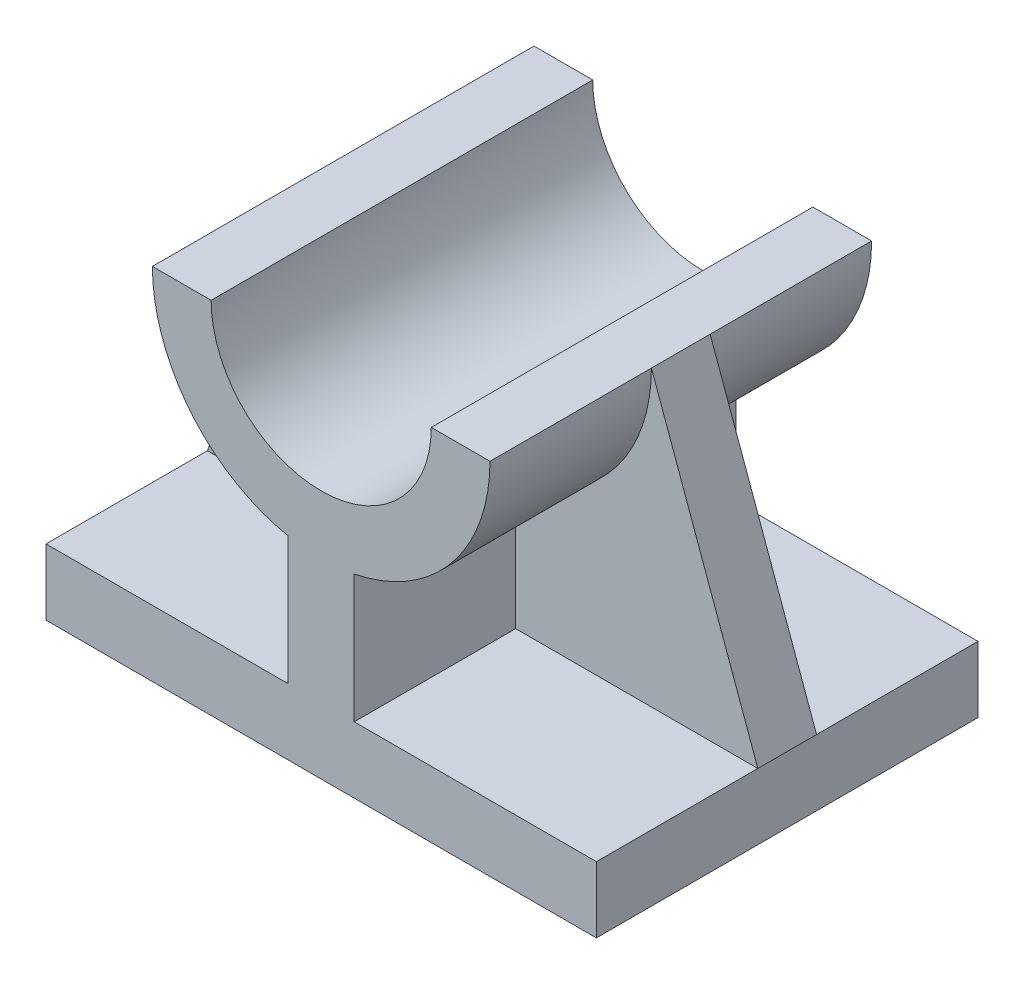
ISO-10303-21;
HEADER;
FILE_DESCRIPTION(('STEP AP214'),'2;1');
FILE_NAME('part.step','',(''),(''),'','','');
FILE_SCHEMA(('AUTOMOTIVE_DESIGN { 1 0 10303 214 1 1 1 1 }'));
ENDSEC;
DATA;
#1=APPLICATION_CONTEXT('core data for automotive mechanical design processes');
#2=APPLICATION_PROTOCOL_DEFINITION('international standard','automotive_design',2000,#1);
#3=PRODUCT_CONTEXT('',#1,'mechanical');
#4=PRODUCT('Part','Part','',(#3));
#5=PRODUCT_RELATED_PRODUCT_CATEGORY('part','',(#4));
#6=PRODUCT_DEFINITION_FORMATION('','',#4);
#7=PRODUCT_DEFINITION_CONTEXT('part definition',#1,'design');
#8=PRODUCT_DEFINITION('design','',#6,#7);
#9=PRODUCT_DEFINITION_SHAPE('','',#8);
#10=(LENGTH_UNIT() NAMED_UNIT(*) SI_UNIT(.MILLI.,.METRE.));
#11=(NAMED_UNIT(*) PLANE_ANGLE_UNIT() SI_UNIT($,.RADIAN.));
#12=(NAMED_UNIT(*) SI_UNIT($,.STERADIAN.) SOLID_ANGLE_UNIT());
#13=UNCERTAINTY_MEASURE_WITH_UNIT(LENGTH_MEASURE(1.E-05),#10,'distance_accuracy_value','');
#14=(GEOMETRIC_REPRESENTATION_CONTEXT(3) GLOBAL_UNCERTAINTY_ASSIGNED_CONTEXT((#13)) GLOBAL_UNIT_ASSIGNED_CONTEXT((#10,
#11,#12)) REPRESENTATION_CONTEXT('',''));
#15=CARTESIAN_POINT('',(0.,0.,0.));
#16=DIRECTION('',(0.,0.,1.));
#17=DIRECTION('',(1.,0.,0.));
#18=AXIS2_PLACEMENT_3D('',#15,#16,#17);
#19=CARTESIAN_POINT('',(0.,44.5,26.));
#20=DIRECTION('',(0.,0.,-1.));
#21=DIRECTION('',(-1.,0.,0.));
#22=AXIS2_PLACEMENT_3D('',#19,#20,#21);
#23=CYLINDRICAL_SURFACE('',#22,23.);
#24=CARTESIAN_POINT('',(0.,44.5,-4.));
#25=DIRECTION('',(0.,0.,1.));
#26=DIRECTION('',(1.,0.,0.));
#27=AXIS2_PLACEMENT_3D('',#24,#25,#26);
#28=CIRCLE('',#27,23.);
#29=CARTESIAN_POINT('',(-23.,44.5,-4.));
#30=VERTEX_POINT('',#29);
#31=CARTESIAN_POINT('',(-4.50000000000001,21.9445128627201,-4.));
#32=VERTEX_POINT('',#31);
#33=EDGE_CURVE('E182',#30,#32,#28,.T.);
#34=ORIENTED_EDGE('',*,*,#33,.F.);
#35=DIRECTION('',(0.,0.,-1.));
#36=VECTOR('',#35,1.);
#37=CARTESIAN_POINT('',(-23.,44.5,26.));
#38=LINE('',#37,#36);
#39=CARTESIAN_POINT('',(-23.,44.5,-26.));
#40=VERTEX_POINT('',#39);
#41=EDGE_CURVE('E191',#30,#40,#38,.T.);
#42=ORIENTED_EDGE('',*,*,#41,.T.);
#43=CARTESIAN_POINT('',(0.,44.5,-26.));
#44=DIRECTION('',(0.,0.,1.));
#45=DIRECTION('',(1.,0.,0.));
#46=AXIS2_PLACEMENT_3D('',#43,#44,#45);
#47=CIRCLE('',#46,23.);
#48=CARTESIAN_POINT('',(-4.50000000000001,21.9445128627201,-26.));
#49=VERTEX_POINT('',#48);
#50=EDGE_CURVE('E264',#40,#49,#47,.T.);
#51=ORIENTED_EDGE('',*,*,#50,.T.);
#52=DIRECTION('',(0.,0.,-1.));
#53=VECTOR('',#52,1.);
#54=CARTESIAN_POINT('',(-4.50000000000001,21.9445128627201,26.));
#55=LINE('',#54,#53);
#56=EDGE_CURVE('E193',#32,#49,#55,.T.);
#57=ORIENTED_EDGE('',*,*,#56,.F.);
#58=EDGE_LOOP('',(#34,#42,#51,#57));
#59=FACE_BOUND('',#58,.T.);
#60=ADVANCED_FACE('F33',(#59),#23,.T.);
#61=CARTESIAN_POINT('',(-4.50000000000001,4.5,26.));
#62=DIRECTION('',(1.,0.,0.));
#63=DIRECTION('',(0.,0.,-1.));
#64=AXIS2_PLACEMENT_3D('',#61,#62,#63);
#65=PLANE('',#64);
#66=DIRECTION('',(0.,-1.,0.));
#67=VECTOR('',#66,1.);
#68=CARTESIAN_POINT('',(-4.50000000000001,4.5,-4.));
#69=LINE('',#68,#67);
#70=CARTESIAN_POINT('',(-4.50000000000001,4.5,-4.));
#71=VERTEX_POINT('',#70);
#72=EDGE_CURVE('E195',#32,#71,#69,.T.);
#73=ORIENTED_EDGE('',*,*,#72,.F.);
#74=ORIENTED_EDGE('',*,*,#56,.T.);
#75=DIRECTION('',(0.,-1.,0.));
#76=VECTOR('',#75,1.);
#77=CARTESIAN_POINT('',(-4.50000000000001,4.5,-26.));
#78=LINE('',#77,#76);
#79=CARTESIAN_POINT('',(-4.50000000000001,4.5,-26.));
#80=VERTEX_POINT('',#79);
#81=EDGE_CURVE('E266',#49,#80,#78,.T.);
#82=ORIENTED_EDGE('',*,*,#81,.T.);
#83=DIRECTION('',(0.,0.,-1.));
#84=VECTOR('',#83,1.);
#85=CARTESIAN_POINT('',(-4.50000000000001,4.5,26.));
#86=LINE('',#85,#84);
#87=EDGE_CURVE('E287',#71,#80,#86,.T.);
#88=ORIENTED_EDGE('',*,*,#87,.F.);
#89=EDGE_LOOP('',(#73,#74,#82,#88));
#90=FACE_BOUND('',#89,.T.);
#91=ADVANCED_FACE('F302',(#90),#65,.F.);
#92=CARTESIAN_POINT('',(-37.5,4.5,26.));
#93=DIRECTION('',(0.,-1.,0.));
#94=DIRECTION('',(0.,0.,-1.));
#95=AXIS2_PLACEMENT_3D('',#92,#93,#94);
#96=PLANE('',#95);
#97=DIRECTION('',(-1.,0.,0.));
#98=VECTOR('',#97,1.);
#99=CARTESIAN_POINT('',(-37.5,4.5,-4.));
#100=LINE('',#99,#98);
#101=CARTESIAN_POINT('',(-37.5,4.5,-3.99999999999999));
#102=VERTEX_POINT('',#101);
#103=EDGE_CURVE('E185',#71,#102,#100,.T.);
#104=ORIENTED_EDGE('',*,*,#103,.F.);
#105=ORIENTED_EDGE('',*,*,#87,.T.);
#106=DIRECTION('',(-1.,0.,0.));
#107=VECTOR('',#106,1.);
#108=CARTESIAN_POINT('',(-37.5,4.5,-26.));
#109=LINE('',#108,#107);
#110=CARTESIAN_POINT('',(-37.5,4.5,-26.));
#111=VERTEX_POINT('',#110);
#112=EDGE_CURVE('E269',#80,#111,#109,.T.);
#113=ORIENTED_EDGE('',*,*,#112,.T.);
#114=DIRECTION('',(0.,0.,-1.));
#115=VECTOR('',#114,1.);
#116=CARTESIAN_POINT('',(-37.5,4.5,26.));
#117=LINE('',#116,#115);
#118=EDGE_CURVE('E284',#102,#111,#117,.T.);
#119=ORIENTED_EDGE('',*,*,#118,.F.);
#120=EDGE_LOOP('',(#104,#105,#113,#119));
#121=FACE_BOUND('',#120,.T.);
#122=ADVANCED_FACE('F297',(#121),#96,.F.);
#123=CARTESIAN_POINT('',(4.49999999999999,4.5,26.));
#124=DIRECTION('',(0.,-1.,0.));
#125=DIRECTION('',(0.,0.,-1.));
#126=AXIS2_PLACEMENT_3D('',#123,#124,#125);
#127=PLANE('',#126);
#128=DIRECTION('',(-1.,0.,0.));
#129=VECTOR('',#128,1.);
#130=CARTESIAN_POINT('',(4.49999999999999,4.5,-4.));
#131=LINE('',#130,#129);
#132=CARTESIAN_POINT('',(37.5,4.5,-4.));
#133=VERTEX_POINT('',#132);
#134=CARTESIAN_POINT('',(4.49999999999999,4.5,-4.));
#135=VERTEX_POINT('',#134);
#136=EDGE_CURVE('E329',#133,#135,#131,.T.);
#137=ORIENTED_EDGE('',*,*,#136,.F.);
#138=DIRECTION('',(0.,0.,-1.));
#139=VECTOR('',#138,1.);
#140=CARTESIAN_POINT('',(37.5,4.5,26.));
#141=LINE('',#140,#139);
#142=CARTESIAN_POINT('',(37.5,4.5,-26.));
#143=VERTEX_POINT('',#142);
#144=EDGE_CURVE('E41',#133,#143,#141,.T.);
#145=ORIENTED_EDGE('',*,*,#144,.T.);
#146=DIRECTION('',(-1.,0.,0.));
#147=VECTOR('',#146,1.);
#148=CARTESIAN_POINT('',(4.49999999999999,4.5,-26.));
#149=LINE('',#148,#147);
#150=CARTESIAN_POINT('',(4.49999999999999,4.5,-26.));
#151=VERTEX_POINT('',#150);
#152=EDGE_CURVE('E241',#143,#151,#149,.T.);
#153=ORIENTED_EDGE('',*,*,#152,.T.);
#154=DIRECTION('',(0.,0.,-1.));
#155=VECTOR('',#154,1.);
#156=CARTESIAN_POINT('',(4.49999999999999,4.5,26.));
#157=LINE('',#156,#155);
#158=EDGE_CURVE('E220',#135,#151,#157,.T.);
#159=ORIENTED_EDGE('',*,*,#158,.F.);
#160=EDGE_LOOP('',(#137,#145,#153,#159));
#161=FACE_BOUND('',#160,.T.);
#162=ADVANCED_FACE('F242',(#161),#127,.F.);
#163=CARTESIAN_POINT('',(4.49999999999999,4.5,26.));
#164=DIRECTION('',(-1.,0.,0.));
#165=DIRECTION('',(0.,0.,1.));
#166=AXIS2_PLACEMENT_3D('',#163,#164,#165);
#167=PLANE('',#166);
#168=DIRECTION('',(0.,1.,0.));
#169=VECTOR('',#168,1.);
#170=CARTESIAN_POINT('',(4.49999999999999,4.5,-4.));
#171=LINE('',#170,#169);
#172=CARTESIAN_POINT('',(4.49999999999999,21.9445128627201,-4.));
#173=VERTEX_POINT('',#172);
#174=EDGE_CURVE('E237',#135,#173,#171,.T.);
#175=ORIENTED_EDGE('',*,*,#174,.F.);
#176=ORIENTED_EDGE('',*,*,#158,.T.);
#177=DIRECTION('',(0.,1.,0.));
#178=VECTOR('',#177,1.);
#179=CARTESIAN_POINT('',(4.49999999999999,4.5,-26.));
#180=LINE('',#179,#178);
#181=CARTESIAN_POINT('',(4.49999999999999,21.9445128627201,-26.));
#182=VERTEX_POINT('',#181);
#183=EDGE_CURVE('E235',#151,#182,#180,.T.);
#184=ORIENTED_EDGE('',*,*,#183,.T.);
#185=DIRECTION('',(0.,0.,-1.));
#186=VECTOR('',#185,1.);
#187=CARTESIAN_POINT('',(4.49999999999999,21.9445128627201,26.));
#188=LINE('',#187,#186);
#189=EDGE_CURVE('E216',#173,#182,#188,.T.);
#190=ORIENTED_EDGE('',*,*,#189,.F.);
#191=EDGE_LOOP('',(#175,#176,#184,#190));
#192=FACE_BOUND('',#191,.T.);
#193=ADVANCED_FACE('F232',(#192),#167,.F.);
#194=CARTESIAN_POINT('',(0.,44.5,26.));
#195=DIRECTION('',(0.,0.,-1.));
#196=DIRECTION('',(-1.,0.,0.));
#197=AXIS2_PLACEMENT_3D('',#194,#195,#196);
#198=CYLINDRICAL_SURFACE('',#197,23.);
#199=CARTESIAN_POINT('',(0.,44.5,-4.));
#200=DIRECTION('',(0.,0.,1.));
#201=DIRECTION('',(1.,0.,0.));
#202=AXIS2_PLACEMENT_3D('',#199,#200,#201);
#203=CIRCLE('',#202,23.);
#204=CARTESIAN_POINT('',(23.,44.5,-3.99999999999999));
#205=VERTEX_POINT('',#204);
#206=EDGE_CURVE('E325',#173,#205,#203,.T.);
#207=ORIENTED_EDGE('',*,*,#206,.F.);
#208=ORIENTED_EDGE('',*,*,#189,.T.);
#209=CARTESIAN_POINT('',(0.,44.5,-26.));
#210=DIRECTION('',(0.,0.,1.));
#211=DIRECTION('',(1.,0.,0.));
#212=AXIS2_PLACEMENT_3D('',#209,#210,#211);
#213=CIRCLE('',#212,23.);
#214=CARTESIAN_POINT('',(23.,44.5,-26.));
#215=VERTEX_POINT('',#214);
#216=EDGE_CURVE('E252',#182,#215,#213,.T.);
#217=ORIENTED_EDGE('',*,*,#216,.T.);
#218=DIRECTION('',(0.,0.,-1.));
#219=VECTOR('',#218,1.);
#220=CARTESIAN_POINT('',(23.,44.5,26.));
#221=LINE('',#220,#219);
#222=EDGE_CURVE('E212',#205,#215,#221,.T.);
#223=ORIENTED_EDGE('',*,*,#222,.F.);
#224=EDGE_LOOP('',(#207,#208,#217,#223));
#225=FACE_BOUND('',#224,.T.);
#226=ADVANCED_FACE('F395',(#225),#198,.T.);
#227=CARTESIAN_POINT('',(37.5,4.5,26.));
#228=DIRECTION('',(-1.,0.,0.));
#229=DIRECTION('',(0.,0.,1.));
#230=AXIS2_PLACEMENT_3D('',#227,#228,#229);
#231=PLANE('',#230);
#232=DIRECTION('',(0.,0.,-1.));
#233=VECTOR('',#232,1.);
#234=CARTESIAN_POINT('',(37.5,-4.5,26.));
#235=LINE('',#234,#233);
#236=CARTESIAN_POINT('',(37.5,-4.5,26.));
#237=VERTEX_POINT('',#236);
#238=CARTESIAN_POINT('',(37.5,-4.5,-26.));
#239=VERTEX_POINT('',#238);
#240=EDGE_CURVE('E279',#237,#239,#235,.T.);
#241=ORIENTED_EDGE('',*,*,#240,.T.);
#242=DIRECTION('',(0.,1.,0.));
#243=VECTOR('',#242,1.);
#244=CARTESIAN_POINT('',(37.5,4.5,-26.));
#245=LINE('',#244,#243);
#246=EDGE_CURVE('E247',#239,#143,#245,.T.);
#247=ORIENTED_EDGE('',*,*,#246,.T.);
#248=ORIENTED_EDGE('',*,*,#144,.F.);
#249=DIRECTION('',(0.,0.,-1.));
#250=VECTOR('',#249,1.);
#251=CARTESIAN_POINT('',(37.5,4.5,26.));
#252=LINE('',#251,#250);
#253=CARTESIAN_POINT('',(37.5,4.5,4.));
#254=VERTEX_POINT('',#253);
#255=EDGE_CURVE('E339',#133,#254,#252,.F.);
#256=ORIENTED_EDGE('',*,*,#255,.T.);
#257=CARTESIAN_POINT('',(37.5,4.5,26.));
#258=VERTEX_POINT('',#257);
#259=EDGE_CURVE('E11',#258,#254,#141,.T.);
#260=ORIENTED_EDGE('',*,*,#259,.F.);
#261=DIRECTION('',(0.,1.,0.));
#262=VECTOR('',#261,1.);
#263=CARTESIAN_POINT('',(37.5,4.5,26.));
#264=LINE('',#263,#262);
#265=EDGE_CURVE('E278',#237,#258,#264,.T.);
#266=ORIENTED_EDGE('',*,*,#265,.F.);
#267=EDGE_LOOP('',(#241,#247,#248,#256,#260,#266));
#268=FACE_BOUND('',#267,.T.);
#269=ADVANCED_FACE('F35',(#268),#231,.F.);
#270=ORIENTED_EDGE('',*,*,#259,.T.);
#271=DIRECTION('',(-1.,0.,0.));
#272=VECTOR('',#271,1.);
#273=CARTESIAN_POINT('',(4.49999999999999,4.5,4.));
#274=LINE('',#273,#272);
#275=CARTESIAN_POINT('',(4.49999999999999,4.5,4.));
#276=VERTEX_POINT('',#275);
#277=EDGE_CURVE('E336',#254,#276,#274,.T.);
#278=ORIENTED_EDGE('',*,*,#277,.T.);
#279=CARTESIAN_POINT('',(4.49999999999999,4.5,26.));
#280=VERTEX_POINT('',#279);
#281=EDGE_CURVE('E221',#280,#276,#157,.T.);
#282=ORIENTED_EDGE('',*,*,#281,.F.);
#283=DIRECTION('',(-1.,0.,0.));
#284=VECTOR('',#283,1.);
#285=CARTESIAN_POINT('',(4.49999999999999,4.5,26.));
#286=LINE('',#285,#284);
#287=EDGE_CURVE('E344',#258,#280,#286,.T.);
#288=ORIENTED_EDGE('',*,*,#287,.F.);
#289=EDGE_LOOP('',(#270,#278,#282,#288));
#290=FACE_BOUND('',#289,.T.);
#291=ADVANCED_FACE('F435',(#290),#127,.F.);
#292=ORIENTED_EDGE('',*,*,#281,.T.);
#293=DIRECTION('',(0.,1.,0.));
#294=VECTOR('',#293,1.);
#295=CARTESIAN_POINT('',(4.49999999999999,4.5,4.));
#296=LINE('',#295,#294);
#297=CARTESIAN_POINT('',(4.49999999999999,21.9445128627201,4.));
#298=VERTEX_POINT('',#297);
#299=EDGE_CURVE('E334',#276,#298,#296,.T.);
#300=ORIENTED_EDGE('',*,*,#299,.T.);
#301=CARTESIAN_POINT('',(4.49999999999999,21.9445128627201,26.));
#302=VERTEX_POINT('',#301);
#303=EDGE_CURVE('E218',#302,#298,#188,.T.);
#304=ORIENTED_EDGE('',*,*,#303,.F.);
#305=DIRECTION('',(0.,1.,0.));
#306=VECTOR('',#305,1.);
#307=CARTESIAN_POINT('',(4.49999999999999,4.5,26.));
#308=LINE('',#307,#306);
#309=EDGE_CURVE('E346',#280,#302,#308,.T.);
#310=ORIENTED_EDGE('',*,*,#309,.F.);
#311=EDGE_LOOP('',(#292,#300,#304,#310));
#312=FACE_BOUND('',#311,.T.);
#313=ADVANCED_FACE('F432',(#312),#167,.F.);
#314=ORIENTED_EDGE('',*,*,#303,.T.);
#315=CARTESIAN_POINT('',(0.,44.5,4.));
#316=DIRECTION('',(0.,0.,1.));
#317=DIRECTION('',(1.,0.,0.));
#318=AXIS2_PLACEMENT_3D('',#315,#316,#317);
#319=CIRCLE('',#318,23.);
#320=CARTESIAN_POINT('',(23.,44.5,4.));
#321=VERTEX_POINT('',#320);
#322=EDGE_CURVE('E331',#298,#321,#319,.T.);
#323=ORIENTED_EDGE('',*,*,#322,.T.);
#324=CARTESIAN_POINT('',(23.,44.5,26.));
#325=VERTEX_POINT('',#324);
#326=EDGE_CURVE('E213',#325,#321,#221,.T.);
#327=ORIENTED_EDGE('',*,*,#326,.F.);
#328=CARTESIAN_POINT('',(0.,44.5,26.));
#329=DIRECTION('',(0.,0.,1.));
#330=DIRECTION('',(1.,0.,0.));
#331=AXIS2_PLACEMENT_3D('',#328,#329,#330);
#332=CIRCLE('',#331,23.);
#333=EDGE_CURVE('E348',#302,#325,#332,.T.);
#334=ORIENTED_EDGE('',*,*,#333,.F.);
#335=EDGE_LOOP('',(#314,#323,#327,#334));
#336=FACE_BOUND('',#335,.T.);
#337=ADVANCED_FACE('F429',(#336),#198,.T.);
#338=CARTESIAN_POINT('',(15.,44.5,26.));
#339=DIRECTION('',(0.,-1.,0.));
#340=DIRECTION('',(0.,0.,-1.));
#341=AXIS2_PLACEMENT_3D('',#338,#339,#340);
#342=PLANE('',#341);
#343=ORIENTED_EDGE('',*,*,#326,.T.);
#344=EDGE_CURVE('E217',#321,#205,#221,.T.);
#345=ORIENTED_EDGE('',*,*,#344,.T.);
#346=ORIENTED_EDGE('',*,*,#222,.T.);
#347=DIRECTION('',(-1.,0.,0.));
#348=VECTOR('',#347,1.);
#349=CARTESIAN_POINT('',(15.,44.5,-26.));
#350=LINE('',#349,#348);
#351=CARTESIAN_POINT('',(15.,44.5,-26.));
#352=VERTEX_POINT('',#351);
#353=EDGE_CURVE('E254',#215,#352,#350,.T.);
#354=ORIENTED_EDGE('',*,*,#353,.T.);
#355=DIRECTION('',(0.,0.,-1.));
#356=VECTOR('',#355,1.);
#357=CARTESIAN_POINT('',(15.,44.5,26.));
#358=LINE('',#357,#356);
#359=CARTESIAN_POINT('',(15.,44.5,26.));
#360=VERTEX_POINT('',#359);
#361=EDGE_CURVE('E210',#360,#352,#358,.T.);
#362=ORIENTED_EDGE('',*,*,#361,.F.);
#363=DIRECTION('',(-1.,0.,0.));
#364=VECTOR('',#363,1.);
#365=CARTESIAN_POINT('',(15.,44.5,26.));
#366=LINE('',#365,#364);
#367=EDGE_CURVE('E350',#325,#360,#366,.T.);
#368=ORIENTED_EDGE('',*,*,#367,.F.);
#369=EDGE_LOOP('',(#343,#345,#346,#354,#362,#368));
#370=FACE_BOUND('',#369,.T.);
#371=ADVANCED_FACE('F390',(#370),#342,.F.);
#372=CARTESIAN_POINT('',(0.,44.5,26.));
#373=DIRECTION('',(0.,0.,-1.));
#374=DIRECTION('',(-1.,0.,0.));
#375=AXIS2_PLACEMENT_3D('',#372,#373,#374);
#376=CYLINDRICAL_SURFACE('',#375,15.);
#377=ORIENTED_EDGE('',*,*,#361,.T.);
#378=CARTESIAN_POINT('',(0.,44.5,-26.));
#379=DIRECTION('',(0.,0.,-1.));
#380=DIRECTION('',(1.,0.,0.));
#381=AXIS2_PLACEMENT_3D('',#378,#379,#380);
#382=CIRCLE('',#381,15.);
#383=CARTESIAN_POINT('',(-15.,44.5,-26.));
#384=VERTEX_POINT('',#383);
#385=EDGE_CURVE('E260',#352,#384,#382,.T.);
#386=ORIENTED_EDGE('',*,*,#385,.T.);
#387=DIRECTION('',(0.,0.,-1.));
#388=VECTOR('',#387,1.);
#389=CARTESIAN_POINT('',(-15.,44.5,26.));
#390=LINE('',#389,#388);
#391=CARTESIAN_POINT('',(-15.,44.5,26.));
#392=VERTEX_POINT('',#391);
#393=EDGE_CURVE('E204',#392,#384,#390,.T.);
#394=ORIENTED_EDGE('',*,*,#393,.F.);
#395=CARTESIAN_POINT('',(0.,44.5,26.));
#396=DIRECTION('',(0.,0.,-1.));
#397=DIRECTION('',(1.,0.,0.));
#398=AXIS2_PLACEMENT_3D('',#395,#396,#397);
#399=CIRCLE('',#398,15.);
#400=EDGE_CURVE('E352',#360,#392,#399,.T.);
#401=ORIENTED_EDGE('',*,*,#400,.F.);
#402=EDGE_LOOP('',(#377,#386,#394,#401));
#403=FACE_BOUND('',#402,.T.);
#404=ADVANCED_FACE('F387',(#403),#376,.F.);
#405=CARTESIAN_POINT('',(-23.,44.5,26.));
#406=DIRECTION('',(0.,-1.,0.));
#407=DIRECTION('',(0.,0.,-1.));
#408=AXIS2_PLACEMENT_3D('',#405,#406,#407);
#409=PLANE('',#408);
#410=ORIENTED_EDGE('',*,*,#393,.T.);
#411=DIRECTION('',(-1.,0.,0.));
#412=VECTOR('',#411,1.);
#413=CARTESIAN_POINT('',(-23.,44.5,-26.));
#414=LINE('',#413,#412);
#415=EDGE_CURVE('E199',#384,#40,#414,.T.);
#416=ORIENTED_EDGE('',*,*,#415,.T.);
#417=ORIENTED_EDGE('',*,*,#41,.F.);
#418=DIRECTION('',(0.,0.,-1.));
#419=VECTOR('',#418,1.);
#420=CARTESIAN_POINT('',(-23.,44.5,26.));
#421=LINE('',#420,#419);
#422=CARTESIAN_POINT('',(-23.,44.5,4.));
#423=VERTEX_POINT('',#422);
#424=EDGE_CURVE('E169',#30,#423,#421,.F.);
#425=ORIENTED_EDGE('',*,*,#424,.T.);
#426=CARTESIAN_POINT('',(-23.,44.5,26.));
#427=VERTEX_POINT('',#426);
#428=EDGE_CURVE('E201',#427,#423,#38,.T.);
#429=ORIENTED_EDGE('',*,*,#428,.F.);
#430=DIRECTION('',(-1.,0.,0.));
#431=VECTOR('',#430,1.);
#432=CARTESIAN_POINT('',(-23.,44.5,26.));
#433=LINE('',#432,#431);
#434=EDGE_CURVE('E354',#392,#427,#433,.T.);
#435=ORIENTED_EDGE('',*,*,#434,.F.);
#436=EDGE_LOOP('',(#410,#416,#417,#425,#429,#435));
#437=FACE_BOUND('',#436,.T.);
#438=ADVANCED_FACE('F197',(#437),#409,.F.);
#439=ORIENTED_EDGE('',*,*,#428,.T.);
#440=CARTESIAN_POINT('',(0.,44.5,4.));
#441=DIRECTION('',(0.,0.,1.));
#442=DIRECTION('',(1.,0.,0.));
#443=AXIS2_PLACEMENT_3D('',#440,#441,#442);
#444=CIRCLE('',#443,23.);
#445=CARTESIAN_POINT('',(-4.50000000000001,21.9445128627201,4.));
#446=VERTEX_POINT('',#445);
#447=EDGE_CURVE('E194',#423,#446,#444,.T.);
#448=ORIENTED_EDGE('',*,*,#447,.T.);
#449=CARTESIAN_POINT('',(-4.50000000000001,21.9445128627201,26.));
#450=VERTEX_POINT('',#449);
#451=EDGE_CURVE('E202',#450,#446,#55,.T.);
#452=ORIENTED_EDGE('',*,*,#451,.F.);
#453=CARTESIAN_POINT('',(0.,44.5,26.));
#454=DIRECTION('',(0.,0.,1.));
#455=DIRECTION('',(1.,0.,0.));
#456=AXIS2_PLACEMENT_3D('',#453,#454,#455);
#457=CIRCLE('',#456,23.);
#458=EDGE_CURVE('E356',#427,#450,#457,.T.);
#459=ORIENTED_EDGE('',*,*,#458,.F.);
#460=EDGE_LOOP('',(#439,#448,#452,#459));
#461=FACE_BOUND('',#460,.T.);
#462=ADVANCED_FACE('F378',(#461),#23,.T.);
#463=ORIENTED_EDGE('',*,*,#451,.T.);
#464=DIRECTION('',(0.,-1.,0.));
#465=VECTOR('',#464,1.);
#466=CARTESIAN_POINT('',(-4.50000000000001,4.5,4.));
#467=LINE('',#466,#465);
#468=CARTESIAN_POINT('',(-4.50000000000001,4.5,4.));
#469=VERTEX_POINT('',#468);
#470=EDGE_CURVE('E317',#446,#469,#467,.T.);
#471=ORIENTED_EDGE('',*,*,#470,.T.);
#472=CARTESIAN_POINT('',(-4.50000000000001,4.5,26.));
#473=VERTEX_POINT('',#472);
#474=EDGE_CURVE('E289',#473,#469,#86,.T.);
#475=ORIENTED_EDGE('',*,*,#474,.F.);
#476=DIRECTION('',(0.,-1.,0.));
#477=VECTOR('',#476,1.);
#478=CARTESIAN_POINT('',(-4.50000000000001,4.5,26.));
#479=LINE('',#478,#477);
#480=EDGE_CURVE('E358',#450,#473,#479,.T.);
#481=ORIENTED_EDGE('',*,*,#480,.F.);
#482=EDGE_LOOP('',(#463,#471,#475,#481));
#483=FACE_BOUND('',#482,.T.);
#484=ADVANCED_FACE('F376',(#483),#65,.F.);
#485=ORIENTED_EDGE('',*,*,#474,.T.);
#486=DIRECTION('',(-1.,0.,0.));
#487=VECTOR('',#486,1.);
#488=CARTESIAN_POINT('',(-37.5,4.5,4.));
#489=LINE('',#488,#487);
#490=CARTESIAN_POINT('',(-37.5,4.49999999999997,4.));
#491=VERTEX_POINT('',#490);
#492=EDGE_CURVE('E177',#469,#491,#489,.T.);
#493=ORIENTED_EDGE('',*,*,#492,.T.);
#494=CARTESIAN_POINT('',(-37.5,4.5,26.));
#495=VERTEX_POINT('',#494);
#496=EDGE_CURVE('E285',#495,#491,#117,.T.);
#497=ORIENTED_EDGE('',*,*,#496,.F.);
#498=DIRECTION('',(-1.,0.,0.));
#499=VECTOR('',#498,1.);
#500=CARTESIAN_POINT('',(-37.5,4.5,26.));
#501=LINE('',#500,#499);
#502=EDGE_CURVE('E360',#473,#495,#501,.T.);
#503=ORIENTED_EDGE('',*,*,#502,.F.);
#504=EDGE_LOOP('',(#485,#493,#497,#503));
#505=FACE_BOUND('',#504,.T.);
#506=ADVANCED_FACE('F316',(#505),#96,.F.);
#507=CARTESIAN_POINT('',(-37.5,4.5,26.));
#508=DIRECTION('',(1.,0.,0.));
#509=DIRECTION('',(0.,0.,-1.));
#510=AXIS2_PLACEMENT_3D('',#507,#508,#509);
#511=PLANE('',#510);
#512=ORIENTED_EDGE('',*,*,#496,.T.);
#513=EDGE_CURVE('E288',#491,#102,#117,.T.);
#514=ORIENTED_EDGE('',*,*,#513,.T.);
#515=ORIENTED_EDGE('',*,*,#118,.T.);
#516=DIRECTION('',(0.,-1.,0.));
#517=VECTOR('',#516,1.);
#518=CARTESIAN_POINT('',(-37.5,4.5,-26.));
#519=LINE('',#518,#517);
#520=CARTESIAN_POINT('',(-37.5,-4.5,-26.));
#521=VERTEX_POINT('',#520);
#522=EDGE_CURVE('E272',#111,#521,#519,.T.);
#523=ORIENTED_EDGE('',*,*,#522,.T.);
#524=DIRECTION('',(0.,0.,-1.));
#525=VECTOR('',#524,1.);
#526=CARTESIAN_POINT('',(-37.5,-4.5,26.));
#527=LINE('',#526,#525);
#528=CARTESIAN_POINT('',(-37.5,-4.5,26.));
#529=VERTEX_POINT('',#528);
#530=EDGE_CURVE('E281',#529,#521,#527,.T.);
#531=ORIENTED_EDGE('',*,*,#530,.F.);
#532=DIRECTION('',(0.,-1.,0.));
#533=VECTOR('',#532,1.);
#534=CARTESIAN_POINT('',(-37.5,4.5,26.));
#535=LINE('',#534,#533);
#536=EDGE_CURVE('E362',#495,#529,#535,.T.);
#537=ORIENTED_EDGE('',*,*,#536,.F.);
#538=EDGE_LOOP('',(#512,#514,#515,#523,#531,#537));
#539=FACE_BOUND('',#538,.T.);
#540=ADVANCED_FACE('F306',(#539),#511,.F.);
#541=CARTESIAN_POINT('',(-37.5,-4.5,26.));
#542=DIRECTION('',(0.,1.,0.));
#543=DIRECTION('',(0.,0.,1.));
#544=AXIS2_PLACEMENT_3D('',#541,#542,#543);
#545=PLANE('',#544);
#546=ORIENTED_EDGE('',*,*,#530,.T.);
#547=DIRECTION('',(1.,0.,0.));
#548=VECTOR('',#547,1.);
#549=CARTESIAN_POINT('',(-37.5,-4.5,-26.));
#550=LINE('',#549,#548);
#551=EDGE_CURVE('E275',#521,#239,#550,.T.);
#552=ORIENTED_EDGE('',*,*,#551,.T.);
#553=ORIENTED_EDGE('',*,*,#240,.F.);
#554=DIRECTION('',(1.,0.,0.));
#555=VECTOR('',#554,1.);
#556=CARTESIAN_POINT('',(-37.5,-4.5,26.));
#557=LINE('',#556,#555);
#558=EDGE_CURVE('E282',#529,#237,#557,.T.);
#559=ORIENTED_EDGE('',*,*,#558,.F.);
#560=EDGE_LOOP('',(#546,#552,#553,#559));
#561=FACE_BOUND('',#560,.T.);
#562=ADVANCED_FACE('F369',(#561),#545,.F.);
#563=CARTESIAN_POINT('',(0.,44.5,26.));
#564=DIRECTION('',(0.,0.,1.));
#565=DIRECTION('',(1.,0.,0.));
#566=AXIS2_PLACEMENT_3D('',#563,#564,#565);
#567=PLANE('',#566);
#568=ORIENTED_EDGE('',*,*,#265,.T.);
#569=ORIENTED_EDGE('',*,*,#287,.T.);
#570=ORIENTED_EDGE('',*,*,#309,.T.);
#571=ORIENTED_EDGE('',*,*,#333,.T.);
#572=ORIENTED_EDGE('',*,*,#367,.T.);
#573=ORIENTED_EDGE('',*,*,#400,.T.);
#574=ORIENTED_EDGE('',*,*,#434,.T.);
#575=ORIENTED_EDGE('',*,*,#458,.T.);
#576=ORIENTED_EDGE('',*,*,#480,.T.);
#577=ORIENTED_EDGE('',*,*,#502,.T.);
#578=ORIENTED_EDGE('',*,*,#536,.T.);
#579=ORIENTED_EDGE('',*,*,#558,.T.);
#580=EDGE_LOOP('',(#568,#569,#570,#571,#572,#573,#574,#575,#576,#577,#578,#579));
#581=FACE_BOUND('',#580,.T.);
#582=ADVANCED_FACE('F371',(#581),#567,.T.);
#583=CARTESIAN_POINT('',(0.,44.5,-26.));
#584=DIRECTION('',(0.,0.,1.));
#585=DIRECTION('',(1.,0.,0.));
#586=AXIS2_PLACEMENT_3D('',#583,#584,#585);
#587=PLANE('',#586);
#588=ORIENTED_EDGE('',*,*,#246,.F.);
#589=ORIENTED_EDGE('',*,*,#551,.F.);
#590=ORIENTED_EDGE('',*,*,#522,.F.);
#591=ORIENTED_EDGE('',*,*,#112,.F.);
#592=ORIENTED_EDGE('',*,*,#81,.F.);
#593=ORIENTED_EDGE('',*,*,#50,.F.);
#594=ORIENTED_EDGE('',*,*,#415,.F.);
#595=ORIENTED_EDGE('',*,*,#385,.F.);
#596=ORIENTED_EDGE('',*,*,#353,.F.);
#597=ORIENTED_EDGE('',*,*,#216,.F.);
#598=ORIENTED_EDGE('',*,*,#183,.F.);
#599=ORIENTED_EDGE('',*,*,#152,.F.);
#600=EDGE_LOOP('',(#588,#589,#590,#591,#592,#593,#594,#595,#596,#597,#598,#599));
#601=FACE_BOUND('',#600,.T.);
#602=ADVANCED_FACE('F249',(#601),#587,.F.);
#603=CARTESIAN_POINT('',(23.,44.5,0.));
#604=DIRECTION('',(-0.940136065162483,-0.3407993236214,0.));
#605=DIRECTION('',(0.3407993236214,-0.940136065162483,0.));
#606=AXIS2_PLACEMENT_3D('',#603,#604,#605);
#607=PLANE('',#606);
#608=ORIENTED_EDGE('',*,*,#255,.F.);
#609=DIRECTION('',(0.3407993236214,-0.940136065162483,0.));
#610=VECTOR('',#609,1.);
#611=CARTESIAN_POINT('',(23.,44.5,-4.));
#612=LINE('',#611,#610);
#613=EDGE_CURVE('E56',#205,#133,#612,.T.);
#614=ORIENTED_EDGE('',*,*,#613,.F.);
#615=ORIENTED_EDGE('',*,*,#344,.F.);
#616=DIRECTION('',(0.3407993236214,-0.940136065162483,0.));
#617=VECTOR('',#616,1.);
#618=CARTESIAN_POINT('',(23.,44.5,4.));
#619=LINE('',#618,#617);
#620=EDGE_CURVE('E322',#321,#254,#619,.T.);
#621=ORIENTED_EDGE('',*,*,#620,.T.);
#622=EDGE_LOOP('',(#608,#614,#615,#621));
#623=FACE_BOUND('',#622,.T.);
#624=ADVANCED_FACE('F406',(#623),#607,.F.);
#625=CARTESIAN_POINT('',(0.,20.,4.));
#626=DIRECTION('',(0.,0.,1.));
#627=DIRECTION('',(1.,0.,0.));
#628=AXIS2_PLACEMENT_3D('',#625,#626,#627);
#629=PLANE('',#628);
#630=ORIENTED_EDGE('',*,*,#277,.F.);
#631=ORIENTED_EDGE('',*,*,#620,.F.);
#632=ORIENTED_EDGE('',*,*,#322,.F.);
#633=ORIENTED_EDGE('',*,*,#299,.F.);
#634=EDGE_LOOP('',(#630,#631,#632,#633));
#635=FACE_BOUND('',#634,.T.);
#636=ADVANCED_FACE('F399',(#635),#629,.T.);
#637=CARTESIAN_POINT('',(0.,20.,-4.));
#638=DIRECTION('',(0.,0.,1.));
#639=DIRECTION('',(1.,0.,0.));
#640=AXIS2_PLACEMENT_3D('',#637,#638,#639);
#641=PLANE('',#640);
#642=ORIENTED_EDGE('',*,*,#613,.T.);
#643=ORIENTED_EDGE('',*,*,#136,.T.);
#644=ORIENTED_EDGE('',*,*,#174,.T.);
#645=ORIENTED_EDGE('',*,*,#206,.T.);
#646=EDGE_LOOP('',(#642,#643,#644,#645));
#647=FACE_BOUND('',#646,.T.);
#648=ADVANCED_FACE('F397',(#647),#641,.F.);
#649=CARTESIAN_POINT('',(-23.,44.5,0.));
#650=DIRECTION('',(-0.940136065162483,0.3407993236214,0.));
#651=DIRECTION('',(-0.3407993236214,-0.940136065162483,0.));
#652=AXIS2_PLACEMENT_3D('',#649,#650,#651);
#653=PLANE('',#652);
#654=ORIENTED_EDGE('',*,*,#424,.F.);
#655=DIRECTION('',(-0.3407993236214,-0.940136065162483,0.));
#656=VECTOR('',#655,1.);
#657=CARTESIAN_POINT('',(-23.,44.5,-4.));
#658=LINE('',#657,#656);
#659=EDGE_CURVE('E48',#30,#102,#658,.T.);
#660=ORIENTED_EDGE('',*,*,#659,.T.);
#661=ORIENTED_EDGE('',*,*,#513,.F.);
#662=DIRECTION('',(-0.3407993236214,-0.940136065162483,0.));
#663=VECTOR('',#662,1.);
#664=CARTESIAN_POINT('',(-23.,44.5,4.));
#665=LINE('',#664,#663);
#666=EDGE_CURVE('E172',#423,#491,#665,.T.);
#667=ORIENTED_EDGE('',*,*,#666,.F.);
#668=EDGE_LOOP('',(#654,#660,#661,#667));
#669=FACE_BOUND('',#668,.T.);
#670=ADVANCED_FACE('F170',(#669),#653,.T.);
#671=CARTESIAN_POINT('',(0.,20.,4.));
#672=DIRECTION('',(0.,0.,1.));
#673=DIRECTION('',(1.,0.,0.));
#674=AXIS2_PLACEMENT_3D('',#671,#672,#673);
#675=PLANE('',#674);
#676=ORIENTED_EDGE('',*,*,#492,.F.);
#677=ORIENTED_EDGE('',*,*,#470,.F.);
#678=ORIENTED_EDGE('',*,*,#447,.F.);
#679=ORIENTED_EDGE('',*,*,#666,.T.);
#680=EDGE_LOOP('',(#676,#677,#678,#679));
#681=FACE_BOUND('',#680,.T.);
#682=ADVANCED_FACE('F312',(#681),#675,.T.);
#683=CARTESIAN_POINT('',(0.,20.,-4.));
#684=DIRECTION('',(0.,0.,1.));
#685=DIRECTION('',(1.,0.,0.));
#686=AXIS2_PLACEMENT_3D('',#683,#684,#685);
#687=PLANE('',#686);
#688=ORIENTED_EDGE('',*,*,#659,.F.);
#689=ORIENTED_EDGE('',*,*,#33,.T.);
#690=ORIENTED_EDGE('',*,*,#72,.T.);
#691=ORIENTED_EDGE('',*,*,#103,.T.);
#692=EDGE_LOOP('',(#688,#689,#690,#691));
#693=FACE_BOUND('',#692,.T.);
#694=ADVANCED_FACE('F181',(#693),#687,.F.);
#695=CLOSED_SHELL('',(#60,#91,#122,#162,#193,#226,#269,#291,#313,#337,#371,#404,#438,#462,#484,
#506,#540,#562,#582,#602,#624,#636,#648,#670,#682,#694));
#696=MANIFOLD_SOLID_BREP('B2',#695);
#697=ADVANCED_BREP_SHAPE_REPRESENTATION('',(#18,#696),#14);
#698=SHAPE_DEFINITION_REPRESENTATION(#9,#697);
ENDSEC;
END-ISO-10303-21;
